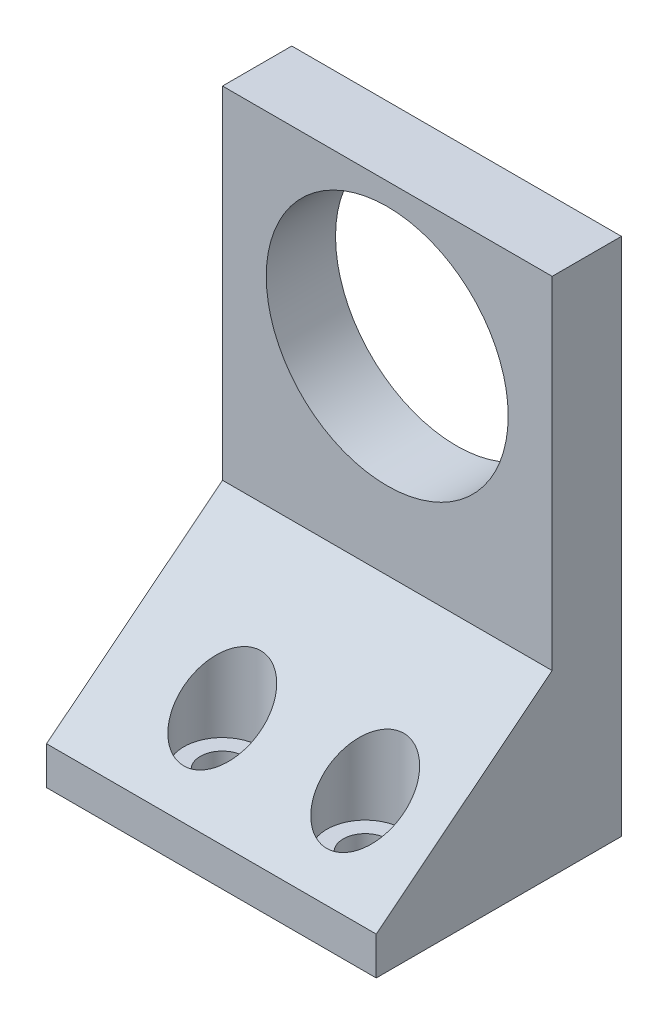
ISO-10303-21;
HEADER;
FILE_DESCRIPTION(('STEP AP214'),'2;1');
FILE_NAME('part.step','',(''),(''),'','','');
FILE_SCHEMA(('AUTOMOTIVE_DESIGN { 1 0 10303 214 1 1 1 1 }'));
ENDSEC;
DATA;
#1=APPLICATION_CONTEXT('core data for automotive mechanical design processes');
#2=APPLICATION_PROTOCOL_DEFINITION('international standard','automotive_design',2000,#1);
#3=PRODUCT_CONTEXT('',#1,'mechanical');
#4=PRODUCT('Part','Part','',(#3));
#5=PRODUCT_RELATED_PRODUCT_CATEGORY('part','',(#4));
#6=PRODUCT_DEFINITION_FORMATION('','',#4);
#7=PRODUCT_DEFINITION_CONTEXT('part definition',#1,'design');
#8=PRODUCT_DEFINITION('design','',#6,#7);
#9=PRODUCT_DEFINITION_SHAPE('','',#8);
#10=(LENGTH_UNIT() NAMED_UNIT(*) SI_UNIT(.MILLI.,.METRE.));
#11=(NAMED_UNIT(*) PLANE_ANGLE_UNIT() SI_UNIT($,.RADIAN.));
#12=(NAMED_UNIT(*) SI_UNIT($,.STERADIAN.) SOLID_ANGLE_UNIT());
#13=UNCERTAINTY_MEASURE_WITH_UNIT(LENGTH_MEASURE(1.E-05),#10,'distance_accuracy_value','');
#14=(GEOMETRIC_REPRESENTATION_CONTEXT(3) GLOBAL_UNCERTAINTY_ASSIGNED_CONTEXT((#13)) GLOBAL_UNIT_ASSIGNED_CONTEXT((#10,
#11,#12)) REPRESENTATION_CONTEXT('',''));
#15=CARTESIAN_POINT('',(0.,0.,0.));
#16=DIRECTION('',(0.,0.,1.));
#17=DIRECTION('',(1.,0.,0.));
#18=AXIS2_PLACEMENT_3D('',#15,#16,#17);
#19=CARTESIAN_POINT('',(-36.1870503597122,18.9280575539568,-20.7));
#20=DIRECTION('',(0.,0.,-1.));
#21=DIRECTION('',(-1.,0.,0.));
#22=AXIS2_PLACEMENT_3D('',#19,#20,#21);
#23=PLANE('',#22);
#24=CARTESIAN_POINT('',(-53.1870503597122,36.9280575539568,-20.7));
#25=DIRECTION('',(0.,0.,1.));
#26=DIRECTION('',(1.,0.,0.));
#27=AXIS2_PLACEMENT_3D('',#24,#25,#26);
#28=CIRCLE('',#27,11.);
#29=CARTESIAN_POINT('',(-42.1870503597123,36.9280575539568,-20.7));
#30=VERTEX_POINT('',#29);
#31=EDGE_CURVE('E120',#30,#30,#28,.T.);
#32=ORIENTED_EDGE('',*,*,#31,.F.);
#33=EDGE_LOOP('',(#32));
#34=FACE_BOUND('',#33,.T.);
#35=DIRECTION('',(0.,1.,0.));
#36=VECTOR('',#35,1.);
#37=CARTESIAN_POINT('',(-38.1870503597122,18.9280575539568,-20.7));
#38=LINE('',#37,#36);
#39=CARTESIAN_POINT('',(-38.1870503597122,18.8781417189645,-20.7));
#40=VERTEX_POINT('',#39);
#41=CARTESIAN_POINT('',(-38.1870503597122,49.9280575539568,-20.7));
#42=VERTEX_POINT('',#41);
#43=EDGE_CURVE('E135',#40,#42,#38,.T.);
#44=ORIENTED_EDGE('',*,*,#43,.T.);
#45=DIRECTION('',(1.,0.,0.));
#46=VECTOR('',#45,1.);
#47=CARTESIAN_POINT('',(-38.1870503597122,49.9280575539568,-20.7));
#48=LINE('',#47,#46);
#49=CARTESIAN_POINT('',(-68.1660613503876,49.9280575539568,-20.7));
#50=VERTEX_POINT('',#49);
#51=EDGE_CURVE('E60',#50,#42,#48,.T.);
#52=ORIENTED_EDGE('',*,*,#51,.F.);
#53=DIRECTION('',(0.,1.,0.));
#54=VECTOR('',#53,1.);
#55=CARTESIAN_POINT('',(-68.1660613503876,49.9280575539568,-20.7));
#56=LINE('',#55,#54);
#57=CARTESIAN_POINT('',(-68.1660613503876,18.8781417189645,-20.7));
#58=VERTEX_POINT('',#57);
#59=EDGE_CURVE('E117',#58,#50,#56,.T.);
#60=ORIENTED_EDGE('',*,*,#59,.F.);
#61=DIRECTION('',(1.,0.,0.));
#62=VECTOR('',#61,1.);
#63=CARTESIAN_POINT('',(-76.1870503597122,18.8781417189645,-20.7));
#64=LINE('',#63,#62);
#65=EDGE_CURVE('E146',#58,#40,#64,.T.);
#66=ORIENTED_EDGE('',*,*,#65,.T.);
#67=EDGE_LOOP('',(#44,#52,#60,#66));
#68=FACE_BOUND('',#67,.T.);
#69=ADVANCED_FACE('F37',(#34,#68),#23,.F.);
#70=CARTESIAN_POINT('',(0.,0.,-27.));
#71=DIRECTION('',(0.,0.,1.));
#72=DIRECTION('',(1.,0.,0.));
#73=AXIS2_PLACEMENT_3D('',#70,#71,#72);
#74=PLANE('',#73);
#75=CARTESIAN_POINT('',(-53.1870503597122,36.9280575539568,-27.));
#76=DIRECTION('',(0.,0.,1.));
#77=DIRECTION('',(1.,0.,0.));
#78=AXIS2_PLACEMENT_3D('',#75,#76,#77);
#79=CIRCLE('',#78,11.);
#80=CARTESIAN_POINT('',(-42.1870503597123,36.9280575539568,-27.));
#81=VERTEX_POINT('',#80);
#82=EDGE_CURVE('E41',#81,#81,#79,.T.);
#83=ORIENTED_EDGE('',*,*,#82,.T.);
#84=EDGE_LOOP('',(#83));
#85=FACE_BOUND('',#84,.T.);
#86=DIRECTION('',(0.,-1.,0.));
#87=VECTOR('',#86,1.);
#88=CARTESIAN_POINT('',(-38.1870503597122,0.,-27.));
#89=LINE('',#88,#87);
#90=CARTESIAN_POINT('',(-38.1870503597122,49.9280575539568,-27.));
#91=VERTEX_POINT('',#90);
#92=CARTESIAN_POINT('',(-38.1870503597122,2.66805755395684,-27.));
#93=VERTEX_POINT('',#92);
#94=EDGE_CURVE('E94',#91,#93,#89,.T.);
#95=ORIENTED_EDGE('',*,*,#94,.T.);
#96=DIRECTION('',(-1.,0.,0.));
#97=VECTOR('',#96,1.);
#98=CARTESIAN_POINT('',(0.,2.66805755395684,-27.));
#99=LINE('',#98,#97);
#100=CARTESIAN_POINT('',(-68.1660613503876,2.66805755395684,-27.));
#101=VERTEX_POINT('',#100);
#102=EDGE_CURVE('E53',#93,#101,#99,.T.);
#103=ORIENTED_EDGE('',*,*,#102,.T.);
#104=DIRECTION('',(0.,-1.,0.));
#105=VECTOR('',#104,1.);
#106=CARTESIAN_POINT('',(-68.1660613503876,2.66805755395684,-27.));
#107=LINE('',#106,#105);
#108=CARTESIAN_POINT('',(-68.1660613503876,49.9280575539568,-27.));
#109=VERTEX_POINT('',#108);
#110=EDGE_CURVE('E92',#109,#101,#107,.T.);
#111=ORIENTED_EDGE('',*,*,#110,.F.);
#112=DIRECTION('',(1.,0.,0.));
#113=VECTOR('',#112,1.);
#114=CARTESIAN_POINT('',(0.,49.9280575539568,-27.));
#115=LINE('',#114,#113);
#116=EDGE_CURVE('E130',#109,#91,#115,.T.);
#117=ORIENTED_EDGE('',*,*,#116,.T.);
#118=EDGE_LOOP('',(#95,#103,#111,#117));
#119=FACE_BOUND('',#118,.T.);
#120=ADVANCED_FACE('F39',(#85,#119),#74,.F.);
#121=CARTESIAN_POINT('',(0.,0.,-4.69999999999999));
#122=DIRECTION('',(0.,0.,1.));
#123=DIRECTION('',(1.,0.,0.));
#124=AXIS2_PLACEMENT_3D('',#121,#122,#123);
#125=PLANE('',#124);
#126=DIRECTION('',(-1.,0.,0.));
#127=VECTOR('',#126,1.);
#128=CARTESIAN_POINT('',(-65.8660613503876,2.66805755395684,-4.69999999999999));
#129=LINE('',#128,#127);
#130=CARTESIAN_POINT('',(-38.1870503597122,2.66805755395684,-4.69999999999999));
#131=VERTEX_POINT('',#130);
#132=CARTESIAN_POINT('',(-68.1660613503876,2.66805755395684,-4.69999999999999));
#133=VERTEX_POINT('',#132);
#134=EDGE_CURVE('E101',#131,#133,#129,.T.);
#135=ORIENTED_EDGE('',*,*,#134,.F.);
#136=DIRECTION('',(0.,-1.,0.));
#137=VECTOR('',#136,1.);
#138=CARTESIAN_POINT('',(-38.1870503597122,0.128057553956839,-4.69999999999999));
#139=LINE('',#138,#137);
#140=CARTESIAN_POINT('',(-38.1870503597122,6.12805755395684,-4.69999999999999));
#141=VERTEX_POINT('',#140);
#142=EDGE_CURVE('E132',#141,#131,#139,.T.);
#143=ORIENTED_EDGE('',*,*,#142,.F.);
#144=DIRECTION('',(-1.,0.,0.));
#145=VECTOR('',#144,1.);
#146=CARTESIAN_POINT('',(-36.1870503597122,6.12805755395684,-4.69999999999999));
#147=LINE('',#146,#145);
#148=CARTESIAN_POINT('',(-68.1660613503876,6.12805755395684,-4.69999999999999));
#149=VERTEX_POINT('',#148);
#150=EDGE_CURVE('E149',#141,#149,#147,.T.);
#151=ORIENTED_EDGE('',*,*,#150,.T.);
#152=DIRECTION('',(0.,1.,0.));
#153=VECTOR('',#152,1.);
#154=CARTESIAN_POINT('',(-68.1660613503876,6.12805755395684,-4.69999999999999));
#155=LINE('',#154,#153);
#156=EDGE_CURVE('E105',#133,#149,#155,.T.);
#157=ORIENTED_EDGE('',*,*,#156,.F.);
#158=EDGE_LOOP('',(#135,#143,#151,#157));
#159=FACE_BOUND('',#158,.T.);
#160=ADVANCED_FACE('F175',(#159),#125,.T.);
#161=CARTESIAN_POINT('',(-45.1870503597122,-9.87194244604316,-10.7));
#162=DIRECTION('',(0.,1.,0.));
#163=DIRECTION('',(-1.,0.,0.));
#164=AXIS2_PLACEMENT_3D('',#161,#162,#163);
#165=CYLINDRICAL_SURFACE('',#164,2.);
#166=CARTESIAN_POINT('',(-45.1870503597122,2.66805755395684,-10.7));
#167=DIRECTION('',(0.,1.,0.));
#168=DIRECTION('',(0.,0.,1.));
#169=AXIS2_PLACEMENT_3D('',#166,#167,#168);
#170=CIRCLE('',#169,2.);
#171=CARTESIAN_POINT('',(-45.1870503597122,2.66805755395684,-8.69999999999999));
#172=VERTEX_POINT('',#171);
#173=EDGE_CURVE('E95',#172,#172,#170,.F.);
#174=ORIENTED_EDGE('',*,*,#173,.T.);
#175=EDGE_LOOP('',(#174));
#176=FACE_BOUND('',#175,.T.);
#177=CARTESIAN_POINT('',(-45.1870503597122,6.12805755395684,-10.7));
#178=DIRECTION('',(0.,-1.,0.));
#179=DIRECTION('',(0.,0.,-1.));
#180=AXIS2_PLACEMENT_3D('',#177,#178,#179);
#181=CIRCLE('',#180,2.);
#182=CARTESIAN_POINT('',(-45.1870503597122,6.12805755395684,-12.7));
#183=VERTEX_POINT('',#182);
#184=EDGE_CURVE('E153',#183,#183,#181,.F.);
#185=ORIENTED_EDGE('',*,*,#184,.T.);
#186=EDGE_LOOP('',(#185));
#187=FACE_BOUND('',#186,.T.);
#188=ADVANCED_FACE('F178',(#176,#187),#165,.F.);
#189=CARTESIAN_POINT('',(-58.1870503597122,-9.87194244604317,-10.7));
#190=DIRECTION('',(0.,1.,0.));
#191=DIRECTION('',(-1.,0.,0.));
#192=AXIS2_PLACEMENT_3D('',#189,#190,#191);
#193=CYLINDRICAL_SURFACE('',#192,2.);
#194=CARTESIAN_POINT('',(-58.1870503597122,2.66805755395684,-10.7));
#195=DIRECTION('',(0.,1.,0.));
#196=DIRECTION('',(0.,0.,1.));
#197=AXIS2_PLACEMENT_3D('',#194,#195,#196);
#198=CIRCLE('',#197,2.);
#199=CARTESIAN_POINT('',(-58.1870503597122,2.66805755395684,-8.7));
#200=VERTEX_POINT('',#199);
#201=EDGE_CURVE('E124',#200,#200,#198,.F.);
#202=ORIENTED_EDGE('',*,*,#201,.T.);
#203=EDGE_LOOP('',(#202));
#204=FACE_BOUND('',#203,.T.);
#205=CARTESIAN_POINT('',(-58.1870503597122,6.12805755395684,-10.7));
#206=DIRECTION('',(0.,-1.,0.));
#207=DIRECTION('',(0.,0.,-1.));
#208=AXIS2_PLACEMENT_3D('',#205,#206,#207);
#209=CIRCLE('',#208,2.);
#210=CARTESIAN_POINT('',(-58.1870503597122,6.12805755395684,-12.7));
#211=VERTEX_POINT('',#210);
#212=EDGE_CURVE('E150',#211,#211,#209,.F.);
#213=ORIENTED_EDGE('',*,*,#212,.T.);
#214=EDGE_LOOP('',(#213));
#215=FACE_BOUND('',#214,.T.);
#216=ADVANCED_FACE('F185',(#204,#215),#193,.F.);
#217=CARTESIAN_POINT('',(-76.1870503597122,6.12805755395684,-4.69999999999999));
#218=DIRECTION('',(0.,0.782057546412734,0.623206221165109));
#219=DIRECTION('',(0.,-0.623206221165109,0.782057546412734));
#220=AXIS2_PLACEMENT_3D('',#217,#218,#219);
#221=PLANE('',#220);
#222=DIRECTION('',(0.,-0.623206221165109,0.782057546412734));
#223=VECTOR('',#222,1.);
#224=CARTESIAN_POINT('',(-38.1870503597122,6.12805755395684,-4.69999999999999));
#225=LINE('',#224,#223);
#226=EDGE_CURVE('E158',#40,#141,#225,.T.);
#227=ORIENTED_EDGE('',*,*,#226,.F.);
#228=ORIENTED_EDGE('',*,*,#65,.F.);
#229=DIRECTION('',(0.,0.623206221165109,-0.782057546412733));
#230=VECTOR('',#229,1.);
#231=CARTESIAN_POINT('',(-68.1660613503876,18.8781417189645,-20.7));
#232=LINE('',#231,#230);
#233=EDGE_CURVE('E114',#149,#58,#232,.T.);
#234=ORIENTED_EDGE('',*,*,#233,.F.);
#235=ORIENTED_EDGE('',*,*,#150,.F.);
#236=EDGE_LOOP('',(#227,#228,#234,#235));
#237=FACE_BOUND('',#236,.T.);
#238=CARTESIAN_POINT('',(-45.1870503597122,10.9093391158347,-10.7));
#239=DIRECTION('',(0.,0.782057546412734,0.623206221165109));
#240=DIRECTION('',(0.,-0.623206221165109,0.782057546412734));
#241=AXIS2_PLACEMENT_3D('',#238,#239,#240);
#242=ELLIPSE('',#241,4.47537398757209,3.5);
#243=CARTESIAN_POINT('',(-45.1870503597122,8.12025820473929,-7.19999999999999));
#244=VERTEX_POINT('',#243);
#245=EDGE_CURVE('E156',#244,#244,#242,.T.);
#246=ORIENTED_EDGE('',*,*,#245,.F.);
#247=EDGE_LOOP('',(#246));
#248=FACE_BOUND('',#247,.T.);
#249=CARTESIAN_POINT('',(-58.1870503597122,10.9093391158347,-10.7));
#250=DIRECTION('',(0.,0.782057546412734,0.623206221165109));
#251=DIRECTION('',(0.,-0.623206221165109,0.782057546412734));
#252=AXIS2_PLACEMENT_3D('',#249,#250,#251);
#253=ELLIPSE('',#252,4.4753739875721,3.50000000000001);
#254=CARTESIAN_POINT('',(-58.1870503597122,8.12025820473928,-7.19999999999999));
#255=VERTEX_POINT('',#254);
#256=EDGE_CURVE('E143',#255,#255,#253,.T.);
#257=ORIENTED_EDGE('',*,*,#256,.F.);
#258=EDGE_LOOP('',(#257));
#259=FACE_BOUND('',#258,.T.);
#260=ADVANCED_FACE('F171',(#237,#248,#259),#221,.T.);
#261=CARTESIAN_POINT('',(-58.1870503597122,6.12805755395684,-10.7));
#262=DIRECTION('',(0.,-1.,0.));
#263=DIRECTION('',(0.,0.,-1.));
#264=AXIS2_PLACEMENT_3D('',#261,#262,#263);
#265=PLANE('',#264);
#266=CARTESIAN_POINT('',(-58.1870503597122,6.12805755395684,-10.7));
#267=DIRECTION('',(0.,-1.,0.));
#268=DIRECTION('',(0.,0.,-1.));
#269=AXIS2_PLACEMENT_3D('',#266,#267,#268);
#270=CIRCLE('',#269,3.50000000000001);
#271=CARTESIAN_POINT('',(-58.1870503597122,6.12805755395684,-14.2));
#272=VERTEX_POINT('',#271);
#273=EDGE_CURVE('E139',#272,#272,#270,.T.);
#274=ORIENTED_EDGE('',*,*,#273,.F.);
#275=EDGE_LOOP('',(#274));
#276=FACE_BOUND('',#275,.T.);
#277=ORIENTED_EDGE('',*,*,#212,.F.);
#278=EDGE_LOOP('',(#277));
#279=FACE_BOUND('',#278,.T.);
#280=ADVANCED_FACE('F223',(#276,#279),#265,.F.);
#281=CARTESIAN_POINT('',(-58.1870503597122,22.1280575539568,-10.7));
#282=DIRECTION('',(0.,-1.,0.));
#283=DIRECTION('',(0.,0.,-1.));
#284=AXIS2_PLACEMENT_3D('',#281,#282,#283);
#285=CYLINDRICAL_SURFACE('',#284,3.50000000000001);
#286=ORIENTED_EDGE('',*,*,#256,.T.);
#287=EDGE_LOOP('',(#286));
#288=FACE_BOUND('',#287,.T.);
#289=ORIENTED_EDGE('',*,*,#273,.T.);
#290=EDGE_LOOP('',(#289));
#291=FACE_BOUND('',#290,.T.);
#292=ADVANCED_FACE('F218',(#288,#291),#285,.F.);
#293=CARTESIAN_POINT('',(-45.1870503597122,6.12805755395684,-10.7));
#294=DIRECTION('',(0.,-1.,0.));
#295=DIRECTION('',(0.,0.,-1.));
#296=AXIS2_PLACEMENT_3D('',#293,#294,#295);
#297=PLANE('',#296);
#298=CARTESIAN_POINT('',(-45.1870503597122,6.12805755395684,-10.7));
#299=DIRECTION('',(0.,-1.,0.));
#300=DIRECTION('',(0.,0.,-1.));
#301=AXIS2_PLACEMENT_3D('',#298,#299,#300);
#302=CIRCLE('',#301,3.5);
#303=CARTESIAN_POINT('',(-45.1870503597122,6.12805755395684,-14.2));
#304=VERTEX_POINT('',#303);
#305=EDGE_CURVE('E140',#304,#304,#302,.T.);
#306=ORIENTED_EDGE('',*,*,#305,.F.);
#307=EDGE_LOOP('',(#306));
#308=FACE_BOUND('',#307,.T.);
#309=ORIENTED_EDGE('',*,*,#184,.F.);
#310=EDGE_LOOP('',(#309));
#311=FACE_BOUND('',#310,.T.);
#312=ADVANCED_FACE('F215',(#308,#311),#297,.F.);
#313=CARTESIAN_POINT('',(-45.1870503597122,22.1280575539568,-10.7));
#314=DIRECTION('',(0.,-1.,0.));
#315=DIRECTION('',(0.,0.,-1.));
#316=AXIS2_PLACEMENT_3D('',#313,#314,#315);
#317=CYLINDRICAL_SURFACE('',#316,3.5);
#318=ORIENTED_EDGE('',*,*,#245,.T.);
#319=EDGE_LOOP('',(#318));
#320=FACE_BOUND('',#319,.T.);
#321=ORIENTED_EDGE('',*,*,#305,.T.);
#322=EDGE_LOOP('',(#321));
#323=FACE_BOUND('',#322,.T.);
#324=ADVANCED_FACE('F214',(#320,#323),#317,.F.);
#325=CARTESIAN_POINT('',(-38.1870503597122,0.128057553956839,-34.7));
#326=DIRECTION('',(-1.,0.,0.));
#327=DIRECTION('',(0.,0.,1.));
#328=AXIS2_PLACEMENT_3D('',#325,#326,#327);
#329=PLANE('',#328);
#330=ORIENTED_EDGE('',*,*,#142,.T.);
#331=DIRECTION('',(0.,0.,-1.));
#332=VECTOR('',#331,1.);
#333=CARTESIAN_POINT('',(-38.1870503597122,2.66805755395684,-34.7));
#334=LINE('',#333,#332);
#335=EDGE_CURVE('E11',#131,#93,#334,.T.);
#336=ORIENTED_EDGE('',*,*,#335,.T.);
#337=ORIENTED_EDGE('',*,*,#94,.F.);
#338=DIRECTION('',(0.,0.,1.));
#339=VECTOR('',#338,1.);
#340=CARTESIAN_POINT('',(-38.1870503597122,49.9280575539568,-34.7));
#341=LINE('',#340,#339);
#342=EDGE_CURVE('E46',#91,#42,#341,.T.);
#343=ORIENTED_EDGE('',*,*,#342,.T.);
#344=ORIENTED_EDGE('',*,*,#43,.F.);
#345=ORIENTED_EDGE('',*,*,#226,.T.);
#346=EDGE_LOOP('',(#330,#336,#337,#343,#344,#345));
#347=FACE_BOUND('',#346,.T.);
#348=ADVANCED_FACE('F165',(#347),#329,.F.);
#349=CARTESIAN_POINT('',(-38.1870503597122,49.9280575539568,-50.7));
#350=DIRECTION('',(0.,-1.,0.));
#351=DIRECTION('',(0.,0.,-1.));
#352=AXIS2_PLACEMENT_3D('',#349,#350,#351);
#353=PLANE('',#352);
#354=ORIENTED_EDGE('',*,*,#116,.F.);
#355=DIRECTION('',(0.,0.,-1.));
#356=VECTOR('',#355,1.);
#357=CARTESIAN_POINT('',(-68.1660613503876,49.9280575539568,-27.));
#358=LINE('',#357,#356);
#359=EDGE_CURVE('E110',#50,#109,#358,.T.);
#360=ORIENTED_EDGE('',*,*,#359,.F.);
#361=ORIENTED_EDGE('',*,*,#51,.T.);
#362=ORIENTED_EDGE('',*,*,#342,.F.);
#363=EDGE_LOOP('',(#354,#360,#361,#362));
#364=FACE_BOUND('',#363,.T.);
#365=ADVANCED_FACE('F207',(#364),#353,.F.);
#366=CARTESIAN_POINT('',(-65.8660613503876,2.66805755395684,-114.7));
#367=DIRECTION('',(0.,1.,0.));
#368=DIRECTION('',(0.,0.,1.));
#369=AXIS2_PLACEMENT_3D('',#366,#367,#368);
#370=PLANE('',#369);
#371=ORIENTED_EDGE('',*,*,#201,.F.);
#372=EDGE_LOOP('',(#371));
#373=FACE_BOUND('',#372,.T.);
#374=ORIENTED_EDGE('',*,*,#173,.F.);
#375=EDGE_LOOP('',(#374));
#376=FACE_BOUND('',#375,.T.);
#377=ORIENTED_EDGE('',*,*,#335,.F.);
#378=ORIENTED_EDGE('',*,*,#134,.T.);
#379=DIRECTION('',(0.,0.,1.));
#380=VECTOR('',#379,1.);
#381=CARTESIAN_POINT('',(-68.1660613503876,2.66805755395684,-4.69999999999999));
#382=LINE('',#381,#380);
#383=EDGE_CURVE('E98',#101,#133,#382,.T.);
#384=ORIENTED_EDGE('',*,*,#383,.F.);
#385=ORIENTED_EDGE('',*,*,#102,.F.);
#386=EDGE_LOOP('',(#377,#378,#384,#385));
#387=FACE_BOUND('',#386,.T.);
#388=ADVANCED_FACE('F99',(#373,#376,#387),#370,.F.);
#389=CARTESIAN_POINT('',(-53.1870503597122,36.9280575539568,-40.7));
#390=DIRECTION('',(0.,0.,1.));
#391=DIRECTION('',(1.,0.,0.));
#392=AXIS2_PLACEMENT_3D('',#389,#390,#391);
#393=CYLINDRICAL_SURFACE('',#392,11.);
#394=ORIENTED_EDGE('',*,*,#31,.T.);
#395=EDGE_LOOP('',(#394));
#396=FACE_BOUND('',#395,.T.);
#397=ORIENTED_EDGE('',*,*,#82,.F.);
#398=EDGE_LOOP('',(#397));
#399=FACE_BOUND('',#398,.T.);
#400=ADVANCED_FACE('F196',(#396,#399),#393,.F.);
#401=CARTESIAN_POINT('',(-68.1660613503876,0.,0.));
#402=DIRECTION('',(1.,0.,0.));
#403=DIRECTION('',(0.,0.,-1.));
#404=AXIS2_PLACEMENT_3D('',#401,#402,#403);
#405=PLANE('',#404);
#406=ORIENTED_EDGE('',*,*,#110,.T.);
#407=ORIENTED_EDGE('',*,*,#383,.T.);
#408=ORIENTED_EDGE('',*,*,#156,.T.);
#409=ORIENTED_EDGE('',*,*,#233,.T.);
#410=ORIENTED_EDGE('',*,*,#59,.T.);
#411=ORIENTED_EDGE('',*,*,#359,.T.);
#412=EDGE_LOOP('',(#406,#407,#408,#409,#410,#411));
#413=FACE_BOUND('',#412,.T.);
#414=ADVANCED_FACE('F108',(#413),#405,.F.);
#415=CLOSED_SHELL('',(#69,#120,#160,#188,#216,#260,#280,#292,#312,#324,#348,#365,#388,#400,#414));
#416=MANIFOLD_SOLID_BREP('B2',#415);
#417=ADVANCED_BREP_SHAPE_REPRESENTATION('',(#18,#416),#14);
#418=SHAPE_DEFINITION_REPRESENTATION(#9,#417);
ENDSEC;
END-ISO-10303-21;
